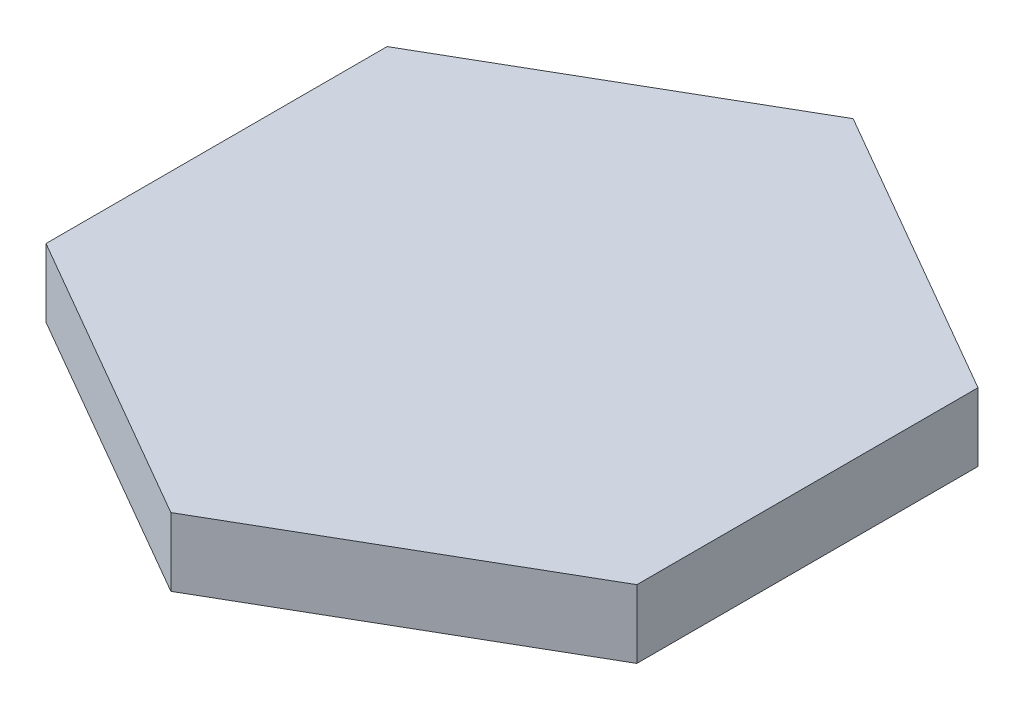
ISO-10303-21;
HEADER;
FILE_DESCRIPTION(('STEP AP214'),'2;1');
FILE_NAME('part.step','',(''),(''),'','','');
FILE_SCHEMA(('AUTOMOTIVE_DESIGN { 1 0 10303 214 1 1 1 1 }'));
ENDSEC;
DATA;
#1=APPLICATION_CONTEXT('core data for automotive mechanical design processes');
#2=APPLICATION_PROTOCOL_DEFINITION('international standard','automotive_design',2000,#1);
#3=PRODUCT_CONTEXT('',#1,'mechanical');
#4=PRODUCT('Part','Part','',(#3));
#5=PRODUCT_RELATED_PRODUCT_CATEGORY('part','',(#4));
#6=PRODUCT_DEFINITION_FORMATION('','',#4);
#7=PRODUCT_DEFINITION_CONTEXT('part definition',#1,'design');
#8=PRODUCT_DEFINITION('design','',#6,#7);
#9=PRODUCT_DEFINITION_SHAPE('','',#8);
#10=(LENGTH_UNIT() NAMED_UNIT(*) SI_UNIT(.MILLI.,.METRE.));
#11=(NAMED_UNIT(*) PLANE_ANGLE_UNIT() SI_UNIT($,.RADIAN.));
#12=(NAMED_UNIT(*) SI_UNIT($,.STERADIAN.) SOLID_ANGLE_UNIT());
#13=UNCERTAINTY_MEASURE_WITH_UNIT(LENGTH_MEASURE(1.E-05),#10,'distance_accuracy_value','');
#14=(GEOMETRIC_REPRESENTATION_CONTEXT(3) GLOBAL_UNCERTAINTY_ASSIGNED_CONTEXT((#13)) GLOBAL_UNIT_ASSIGNED_CONTEXT((#10,
#11,#12)) REPRESENTATION_CONTEXT('',''));
#15=CARTESIAN_POINT('',(0.,0.,0.));
#16=DIRECTION('',(0.,0.,1.));
#17=DIRECTION('',(1.,0.,0.));
#18=AXIS2_PLACEMENT_3D('',#15,#16,#17);
#19=CARTESIAN_POINT('',(27.4963065701563,-6.35,15.8749999999995));
#20=DIRECTION('',(1.,0.,0.));
#21=DIRECTION('',(0.,0.,-1.));
#22=AXIS2_PLACEMENT_3D('',#19,#20,#21);
#23=PLANE('',#22);
#24=DIRECTION('',(0.,0.,-1.));
#25=VECTOR('',#24,1.);
#26=CARTESIAN_POINT('',(27.4963065701563,0.,15.8749999999995));
#27=LINE('',#26,#25);
#28=CARTESIAN_POINT('',(27.4963065701563,0.,15.8749999999995));
#29=VERTEX_POINT('',#28);
#30=CARTESIAN_POINT('',(27.4963065701556,0.,-15.8750000000006));
#31=VERTEX_POINT('',#30);
#32=EDGE_CURVE('E124',#29,#31,#27,.T.);
#33=ORIENTED_EDGE('',*,*,#32,.F.);
#34=DIRECTION('',(0.,1.,0.));
#35=VECTOR('',#34,1.);
#36=CARTESIAN_POINT('',(27.4963065701563,-6.35,15.8749999999995));
#37=LINE('',#36,#35);
#38=CARTESIAN_POINT('',(27.4963065701563,-6.35,15.8749999999995));
#39=VERTEX_POINT('',#38);
#40=EDGE_CURVE('E11',#39,#29,#37,.T.);
#41=ORIENTED_EDGE('',*,*,#40,.F.);
#42=DIRECTION('',(0.,0.,-1.));
#43=VECTOR('',#42,1.);
#44=CARTESIAN_POINT('',(27.4963065701563,-6.35,15.8749999999995));
#45=LINE('',#44,#43);
#46=CARTESIAN_POINT('',(27.4963065701556,-6.35,-15.8750000000006));
#47=VERTEX_POINT('',#46);
#48=EDGE_CURVE('E138',#39,#47,#45,.T.);
#49=ORIENTED_EDGE('',*,*,#48,.T.);
#50=DIRECTION('',(0.,1.,0.));
#51=VECTOR('',#50,1.);
#52=CARTESIAN_POINT('',(27.4963065701556,-6.35,-15.8750000000006));
#53=LINE('',#52,#51);
#54=EDGE_CURVE('E42',#47,#31,#53,.T.);
#55=ORIENTED_EDGE('',*,*,#54,.T.);
#56=EDGE_LOOP('',(#33,#41,#49,#55));
#57=FACE_BOUND('',#56,.T.);
#58=ADVANCED_FACE('F39',(#57),#23,.T.);
#59=CARTESIAN_POINT('',(6.7978121482634E-13,-6.35,31.75));
#60=DIRECTION('',(0.500000000000018,0.,0.866025403784428));
#61=DIRECTION('',(0.866025403784428,0.,-0.500000000000018));
#62=AXIS2_PLACEMENT_3D('',#59,#60,#61);
#63=PLANE('',#62);
#64=DIRECTION('',(0.866025403784428,0.,-0.500000000000018));
#65=VECTOR('',#64,1.);
#66=CARTESIAN_POINT('',(6.7978121482634E-13,0.,31.75));
#67=LINE('',#66,#65);
#68=CARTESIAN_POINT('',(6.7978121482634E-13,0.,31.75));
#69=VERTEX_POINT('',#68);
#70=EDGE_CURVE('E136',#69,#29,#67,.T.);
#71=ORIENTED_EDGE('',*,*,#70,.F.);
#72=DIRECTION('',(0.,1.,0.));
#73=VECTOR('',#72,1.);
#74=CARTESIAN_POINT('',(6.7978121482634E-13,-6.35,31.75));
#75=LINE('',#74,#73);
#76=CARTESIAN_POINT('',(6.7978121482634E-13,-6.35,31.75));
#77=VERTEX_POINT('',#76);
#78=EDGE_CURVE('E48',#77,#69,#75,.T.);
#79=ORIENTED_EDGE('',*,*,#78,.F.);
#80=DIRECTION('',(0.866025403784428,0.,-0.500000000000018));
#81=VECTOR('',#80,1.);
#82=CARTESIAN_POINT('',(6.7978121482634E-13,-6.35,31.75));
#83=LINE('',#82,#81);
#84=EDGE_CURVE('E114',#77,#39,#83,.T.);
#85=ORIENTED_EDGE('',*,*,#84,.T.);
#86=ORIENTED_EDGE('',*,*,#40,.T.);
#87=EDGE_LOOP('',(#71,#79,#85,#86));
#88=FACE_BOUND('',#87,.T.);
#89=ADVANCED_FACE('F146',(#88),#63,.T.);
#90=CARTESIAN_POINT('',(-27.4963065701556,-6.35,15.8750000000006));
#91=DIRECTION('',(-0.499999999999982,0.,0.866025403784449));
#92=DIRECTION('',(0.866025403784449,0.,0.499999999999982));
#93=AXIS2_PLACEMENT_3D('',#90,#91,#92);
#94=PLANE('',#93);
#95=DIRECTION('',(0.866025403784449,0.,0.499999999999982));
#96=VECTOR('',#95,1.);
#97=CARTESIAN_POINT('',(-27.4963065701556,0.,15.8750000000006));
#98=LINE('',#97,#96);
#99=CARTESIAN_POINT('',(-27.4963065701556,0.,15.8750000000006));
#100=VERTEX_POINT('',#99);
#101=EDGE_CURVE('E101',#100,#69,#98,.T.);
#102=ORIENTED_EDGE('',*,*,#101,.F.);
#103=DIRECTION('',(0.,1.,0.));
#104=VECTOR('',#103,1.);
#105=CARTESIAN_POINT('',(-27.4963065701556,-6.35,15.8750000000006));
#106=LINE('',#105,#104);
#107=CARTESIAN_POINT('',(-27.4963065701556,-6.35,15.8750000000006));
#108=VERTEX_POINT('',#107);
#109=EDGE_CURVE('E96',#108,#100,#106,.T.);
#110=ORIENTED_EDGE('',*,*,#109,.F.);
#111=DIRECTION('',(0.866025403784449,0.,0.499999999999982));
#112=VECTOR('',#111,1.);
#113=CARTESIAN_POINT('',(-27.4963065701556,-6.35,15.8750000000006));
#114=LINE('',#113,#112);
#115=EDGE_CURVE('E99',#108,#77,#114,.T.);
#116=ORIENTED_EDGE('',*,*,#115,.T.);
#117=ORIENTED_EDGE('',*,*,#78,.T.);
#118=EDGE_LOOP('',(#102,#110,#116,#117));
#119=FACE_BOUND('',#118,.T.);
#120=ADVANCED_FACE('F98',(#119),#94,.T.);
#121=CARTESIAN_POINT('',(-27.4963065701563,-6.35,-15.8749999999994));
#122=DIRECTION('',(-1.,0.,0.));
#123=DIRECTION('',(0.,0.,1.));
#124=AXIS2_PLACEMENT_3D('',#121,#122,#123);
#125=PLANE('',#124);
#126=DIRECTION('',(0.,0.,1.));
#127=VECTOR('',#126,1.);
#128=CARTESIAN_POINT('',(-27.4963065701563,0.,-15.8749999999994));
#129=LINE('',#128,#127);
#130=CARTESIAN_POINT('',(-27.4963065701563,0.,-15.8749999999994));
#131=VERTEX_POINT('',#130);
#132=EDGE_CURVE('E133',#131,#100,#129,.T.);
#133=ORIENTED_EDGE('',*,*,#132,.F.);
#134=DIRECTION('',(0.,1.,0.));
#135=VECTOR('',#134,1.);
#136=CARTESIAN_POINT('',(-27.4963065701563,-6.35,-15.8749999999994));
#137=LINE('',#136,#135);
#138=CARTESIAN_POINT('',(-27.4963065701563,-6.35,-15.8749999999994));
#139=VERTEX_POINT('',#138);
#140=EDGE_CURVE('E106',#139,#131,#137,.T.);
#141=ORIENTED_EDGE('',*,*,#140,.F.);
#142=DIRECTION('',(0.,0.,1.));
#143=VECTOR('',#142,1.);
#144=CARTESIAN_POINT('',(-27.4963065701563,-6.35,-15.8749999999994));
#145=LINE('',#144,#143);
#146=EDGE_CURVE('E112',#139,#108,#145,.T.);
#147=ORIENTED_EDGE('',*,*,#146,.T.);
#148=ORIENTED_EDGE('',*,*,#109,.T.);
#149=EDGE_LOOP('',(#133,#141,#147,#148));
#150=FACE_BOUND('',#149,.T.);
#151=ADVANCED_FACE('F116',(#150),#125,.T.);
#152=CARTESIAN_POINT('',(-6.66931354504093E-13,-6.35,-31.75));
#153=DIRECTION('',(-0.500000000000018,0.,-0.866025403784428));
#154=DIRECTION('',(-0.866025403784428,0.,0.500000000000018));
#155=AXIS2_PLACEMENT_3D('',#152,#153,#154);
#156=PLANE('',#155);
#157=DIRECTION('',(-0.866025403784428,0.,0.500000000000018));
#158=VECTOR('',#157,1.);
#159=CARTESIAN_POINT('',(-6.66931354504093E-13,0.,-31.75));
#160=LINE('',#159,#158);
#161=CARTESIAN_POINT('',(-6.66931354504093E-13,0.,-31.75));
#162=VERTEX_POINT('',#161);
#163=EDGE_CURVE('E130',#162,#131,#160,.T.);
#164=ORIENTED_EDGE('',*,*,#163,.F.);
#165=DIRECTION('',(0.,1.,0.));
#166=VECTOR('',#165,1.);
#167=CARTESIAN_POINT('',(-6.66931354504093E-13,-6.35,-31.75));
#168=LINE('',#167,#166);
#169=CARTESIAN_POINT('',(-6.66931354504093E-13,-6.35,-31.75));
#170=VERTEX_POINT('',#169);
#171=EDGE_CURVE('E141',#170,#162,#168,.T.);
#172=ORIENTED_EDGE('',*,*,#171,.F.);
#173=DIRECTION('',(-0.866025403784428,0.,0.500000000000018));
#174=VECTOR('',#173,1.);
#175=CARTESIAN_POINT('',(-6.66931354504093E-13,-6.35,-31.75));
#176=LINE('',#175,#174);
#177=EDGE_CURVE('E117',#170,#139,#176,.T.);
#178=ORIENTED_EDGE('',*,*,#177,.T.);
#179=ORIENTED_EDGE('',*,*,#140,.T.);
#180=EDGE_LOOP('',(#164,#172,#178,#179));
#181=FACE_BOUND('',#180,.T.);
#182=ADVANCED_FACE('F159',(#181),#156,.T.);
#183=CARTESIAN_POINT('',(27.4963065701556,-6.35,-15.8750000000006));
#184=DIRECTION('',(0.499999999999981,0.,-0.866025403784449));
#185=DIRECTION('',(-0.866025403784449,0.,-0.499999999999982));
#186=AXIS2_PLACEMENT_3D('',#183,#184,#185);
#187=PLANE('',#186);
#188=DIRECTION('',(-0.866025403784449,0.,-0.499999999999982));
#189=VECTOR('',#188,1.);
#190=CARTESIAN_POINT('',(27.4963065701556,0.,-15.8750000000006));
#191=LINE('',#190,#189);
#192=EDGE_CURVE('E127',#31,#162,#191,.T.);
#193=ORIENTED_EDGE('',*,*,#192,.F.);
#194=ORIENTED_EDGE('',*,*,#54,.F.);
#195=DIRECTION('',(-0.866025403784449,0.,-0.499999999999982));
#196=VECTOR('',#195,1.);
#197=CARTESIAN_POINT('',(27.4963065701556,-6.35,-15.8750000000006));
#198=LINE('',#197,#196);
#199=EDGE_CURVE('E119',#47,#170,#198,.T.);
#200=ORIENTED_EDGE('',*,*,#199,.T.);
#201=ORIENTED_EDGE('',*,*,#171,.T.);
#202=EDGE_LOOP('',(#193,#194,#200,#201));
#203=FACE_BOUND('',#202,.T.);
#204=ADVANCED_FACE('F143',(#203),#187,.T.);
#205=CARTESIAN_POINT('',(0.,-6.35,0.));
#206=DIRECTION('',(0.,1.,0.));
#207=DIRECTION('',(0.,0.,1.));
#208=AXIS2_PLACEMENT_3D('',#205,#206,#207);
#209=PLANE('',#208);
#210=ORIENTED_EDGE('',*,*,#48,.F.);
#211=ORIENTED_EDGE('',*,*,#84,.F.);
#212=ORIENTED_EDGE('',*,*,#115,.F.);
#213=ORIENTED_EDGE('',*,*,#146,.F.);
#214=ORIENTED_EDGE('',*,*,#177,.F.);
#215=ORIENTED_EDGE('',*,*,#199,.F.);
#216=EDGE_LOOP('',(#210,#211,#212,#213,#214,#215));
#217=FACE_BOUND('',#216,.T.);
#218=ADVANCED_FACE('F110',(#217),#209,.F.);
#219=CARTESIAN_POINT('',(0.,0.,0.));
#220=DIRECTION('',(0.,1.,0.));
#221=DIRECTION('',(0.,0.,1.));
#222=AXIS2_PLACEMENT_3D('',#219,#220,#221);
#223=PLANE('',#222);
#224=ORIENTED_EDGE('',*,*,#32,.T.);
#225=ORIENTED_EDGE('',*,*,#192,.T.);
#226=ORIENTED_EDGE('',*,*,#163,.T.);
#227=ORIENTED_EDGE('',*,*,#132,.T.);
#228=ORIENTED_EDGE('',*,*,#101,.T.);
#229=ORIENTED_EDGE('',*,*,#70,.T.);
#230=EDGE_LOOP('',(#224,#225,#226,#227,#228,#229));
#231=FACE_BOUND('',#230,.T.);
#232=ADVANCED_FACE('F145',(#231),#223,.T.);
#233=CLOSED_SHELL('',(#58,#89,#120,#151,#182,#204,#218,#232));
#234=MANIFOLD_SOLID_BREP('B2',#233);
#235=ADVANCED_BREP_SHAPE_REPRESENTATION('',(#18,#234),#14);
#236=SHAPE_DEFINITION_REPRESENTATION(#9,#235);
ENDSEC;
END-ISO-10303-21;
